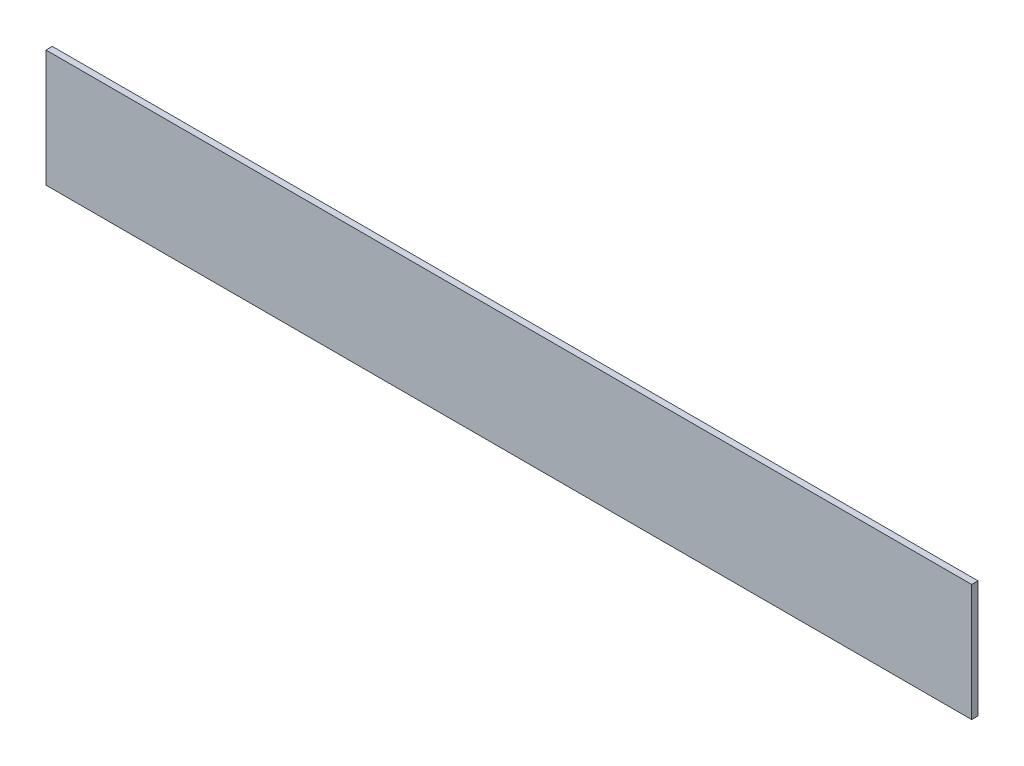
ISO-10303-21;
HEADER;
FILE_DESCRIPTION(('STEP AP214'),'2;1');
FILE_NAME('part.step','',(''),(''),'','','');
FILE_SCHEMA(('AUTOMOTIVE_DESIGN { 1 0 10303 214 1 1 1 1 }'));
ENDSEC;
DATA;
#1=APPLICATION_CONTEXT('core data for automotive mechanical design processes');
#2=APPLICATION_PROTOCOL_DEFINITION('international standard','automotive_design',2000,#1);
#3=PRODUCT_CONTEXT('',#1,'mechanical');
#4=PRODUCT('Part','Part','',(#3));
#5=PRODUCT_RELATED_PRODUCT_CATEGORY('part','',(#4));
#6=PRODUCT_DEFINITION_FORMATION('','',#4);
#7=PRODUCT_DEFINITION_CONTEXT('part definition',#1,'design');
#8=PRODUCT_DEFINITION('design','',#6,#7);
#9=PRODUCT_DEFINITION_SHAPE('','',#8);
#10=(LENGTH_UNIT() NAMED_UNIT(*) SI_UNIT(.MILLI.,.METRE.));
#11=(NAMED_UNIT(*) PLANE_ANGLE_UNIT() SI_UNIT($,.RADIAN.));
#12=(NAMED_UNIT(*) SI_UNIT($,.STERADIAN.) SOLID_ANGLE_UNIT());
#13=UNCERTAINTY_MEASURE_WITH_UNIT(LENGTH_MEASURE(1.E-05),#10,'distance_accuracy_value','');
#14=(GEOMETRIC_REPRESENTATION_CONTEXT(3) GLOBAL_UNCERTAINTY_ASSIGNED_CONTEXT((#13)) GLOBAL_UNIT_ASSIGNED_CONTEXT((#10,
#11,#12)) REPRESENTATION_CONTEXT('',''));
#15=CARTESIAN_POINT('',(0.,0.,0.));
#16=DIRECTION('',(0.,0.,1.));
#17=DIRECTION('',(1.,0.,0.));
#18=AXIS2_PLACEMENT_3D('',#15,#16,#17);
#19=CARTESIAN_POINT('',(-219.5,-27.75,-3.));
#20=DIRECTION('',(-1.,0.,0.));
#21=DIRECTION('',(0.,0.,1.));
#22=AXIS2_PLACEMENT_3D('',#19,#20,#21);
#23=PLANE('',#22);
#24=DIRECTION('',(0.,-1.,0.));
#25=VECTOR('',#24,1.);
#26=CARTESIAN_POINT('',(-219.5,-27.75,0.));
#27=LINE('',#26,#25);
#28=CARTESIAN_POINT('',(-219.5,27.75,0.));
#29=VERTEX_POINT('',#28);
#30=CARTESIAN_POINT('',(-219.5,-27.75,0.));
#31=VERTEX_POINT('',#30);
#32=EDGE_CURVE('E96',#29,#31,#27,.T.);
#33=ORIENTED_EDGE('',*,*,#32,.F.);
#34=DIRECTION('',(0.,0.,1.));
#35=VECTOR('',#34,1.);
#36=CARTESIAN_POINT('',(-219.5,27.75,-3.));
#37=LINE('',#36,#35);
#38=CARTESIAN_POINT('',(-219.5,27.75,-3.));
#39=VERTEX_POINT('',#38);
#40=EDGE_CURVE('E11',#39,#29,#37,.T.);
#41=ORIENTED_EDGE('',*,*,#40,.F.);
#42=DIRECTION('',(0.,-1.,0.));
#43=VECTOR('',#42,1.);
#44=CARTESIAN_POINT('',(-219.5,-27.75,-3.));
#45=LINE('',#44,#43);
#46=CARTESIAN_POINT('',(-219.5,-27.75,-3.));
#47=VERTEX_POINT('',#46);
#48=EDGE_CURVE('E90',#39,#47,#45,.T.);
#49=ORIENTED_EDGE('',*,*,#48,.T.);
#50=DIRECTION('',(0.,0.,1.));
#51=VECTOR('',#50,1.);
#52=CARTESIAN_POINT('',(-219.5,-27.75,-3.));
#53=LINE('',#52,#51);
#54=EDGE_CURVE('E35',#47,#31,#53,.T.);
#55=ORIENTED_EDGE('',*,*,#54,.T.);
#56=EDGE_LOOP('',(#33,#41,#49,#55));
#57=FACE_BOUND('',#56,.T.);
#58=ADVANCED_FACE('F32',(#57),#23,.T.);
#59=CARTESIAN_POINT('',(219.5,27.75,-3.));
#60=DIRECTION('',(0.,1.,0.));
#61=DIRECTION('',(-1.,0.,0.));
#62=AXIS2_PLACEMENT_3D('',#59,#60,#61);
#63=PLANE('',#62);
#64=DIRECTION('',(-1.,0.,0.));
#65=VECTOR('',#64,1.);
#66=CARTESIAN_POINT('',(219.5,27.75,0.));
#67=LINE('',#66,#65);
#68=CARTESIAN_POINT('',(219.5,27.75,0.));
#69=VERTEX_POINT('',#68);
#70=EDGE_CURVE('E92',#69,#29,#67,.T.);
#71=ORIENTED_EDGE('',*,*,#70,.F.);
#72=DIRECTION('',(0.,0.,1.));
#73=VECTOR('',#72,1.);
#74=CARTESIAN_POINT('',(219.5,27.75,-3.));
#75=LINE('',#74,#73);
#76=CARTESIAN_POINT('',(219.5,27.75,-3.));
#77=VERTEX_POINT('',#76);
#78=EDGE_CURVE('E41',#77,#69,#75,.T.);
#79=ORIENTED_EDGE('',*,*,#78,.F.);
#80=DIRECTION('',(-1.,0.,0.));
#81=VECTOR('',#80,1.);
#82=CARTESIAN_POINT('',(219.5,27.75,-3.));
#83=LINE('',#82,#81);
#84=EDGE_CURVE('E87',#77,#39,#83,.T.);
#85=ORIENTED_EDGE('',*,*,#84,.T.);
#86=ORIENTED_EDGE('',*,*,#40,.T.);
#87=EDGE_LOOP('',(#71,#79,#85,#86));
#88=FACE_BOUND('',#87,.T.);
#89=ADVANCED_FACE('F106',(#88),#63,.T.);
#90=CARTESIAN_POINT('',(219.5,-27.75,-3.));
#91=DIRECTION('',(1.,0.,0.));
#92=DIRECTION('',(0.,0.,-1.));
#93=AXIS2_PLACEMENT_3D('',#90,#91,#92);
#94=PLANE('',#93);
#95=DIRECTION('',(0.,1.,0.));
#96=VECTOR('',#95,1.);
#97=CARTESIAN_POINT('',(219.5,-27.75,0.));
#98=LINE('',#97,#96);
#99=CARTESIAN_POINT('',(219.5,-27.75,0.));
#100=VERTEX_POINT('',#99);
#101=EDGE_CURVE('E82',#100,#69,#98,.T.);
#102=ORIENTED_EDGE('',*,*,#101,.F.);
#103=DIRECTION('',(0.,0.,1.));
#104=VECTOR('',#103,1.);
#105=CARTESIAN_POINT('',(219.5,-27.75,-3.));
#106=LINE('',#105,#104);
#107=CARTESIAN_POINT('',(219.5,-27.75,-3.));
#108=VERTEX_POINT('',#107);
#109=EDGE_CURVE('E77',#108,#100,#106,.T.);
#110=ORIENTED_EDGE('',*,*,#109,.F.);
#111=DIRECTION('',(0.,1.,0.));
#112=VECTOR('',#111,1.);
#113=CARTESIAN_POINT('',(219.5,-27.75,-3.));
#114=LINE('',#113,#112);
#115=EDGE_CURVE('E80',#108,#77,#114,.T.);
#116=ORIENTED_EDGE('',*,*,#115,.T.);
#117=ORIENTED_EDGE('',*,*,#78,.T.);
#118=EDGE_LOOP('',(#102,#110,#116,#117));
#119=FACE_BOUND('',#118,.T.);
#120=ADVANCED_FACE('F79',(#119),#94,.T.);
#121=CARTESIAN_POINT('',(219.5,-27.75,-3.));
#122=DIRECTION('',(0.,-1.,0.));
#123=DIRECTION('',(1.,0.,0.));
#124=AXIS2_PLACEMENT_3D('',#121,#122,#123);
#125=PLANE('',#124);
#126=DIRECTION('',(1.,0.,0.));
#127=VECTOR('',#126,1.);
#128=CARTESIAN_POINT('',(219.5,-27.75,0.));
#129=LINE('',#128,#127);
#130=EDGE_CURVE('E99',#31,#100,#129,.T.);
#131=ORIENTED_EDGE('',*,*,#130,.F.);
#132=ORIENTED_EDGE('',*,*,#54,.F.);
#133=DIRECTION('',(1.,0.,0.));
#134=VECTOR('',#133,1.);
#135=CARTESIAN_POINT('',(219.5,-27.75,-3.));
#136=LINE('',#135,#134);
#137=EDGE_CURVE('E86',#47,#108,#136,.T.);
#138=ORIENTED_EDGE('',*,*,#137,.T.);
#139=ORIENTED_EDGE('',*,*,#109,.T.);
#140=EDGE_LOOP('',(#131,#132,#138,#139));
#141=FACE_BOUND('',#140,.T.);
#142=ADVANCED_FACE('F89',(#141),#125,.T.);
#143=CARTESIAN_POINT('',(0.,0.,-3.));
#144=DIRECTION('',(0.,0.,1.));
#145=DIRECTION('',(1.,0.,0.));
#146=AXIS2_PLACEMENT_3D('',#143,#144,#145);
#147=PLANE('',#146);
#148=ORIENTED_EDGE('',*,*,#48,.F.);
#149=ORIENTED_EDGE('',*,*,#84,.F.);
#150=ORIENTED_EDGE('',*,*,#115,.F.);
#151=ORIENTED_EDGE('',*,*,#137,.F.);
#152=EDGE_LOOP('',(#148,#149,#150,#151));
#153=FACE_BOUND('',#152,.T.);
#154=ADVANCED_FACE('F85',(#153),#147,.F.);
#155=CARTESIAN_POINT('',(0.,0.,0.));
#156=DIRECTION('',(0.,0.,1.));
#157=DIRECTION('',(1.,0.,0.));
#158=AXIS2_PLACEMENT_3D('',#155,#156,#157);
#159=PLANE('',#158);
#160=ORIENTED_EDGE('',*,*,#32,.T.);
#161=ORIENTED_EDGE('',*,*,#130,.T.);
#162=ORIENTED_EDGE('',*,*,#101,.T.);
#163=ORIENTED_EDGE('',*,*,#70,.T.);
#164=EDGE_LOOP('',(#160,#161,#162,#163));
#165=FACE_BOUND('',#164,.T.);
#166=ADVANCED_FACE('F105',(#165),#159,.T.);
#167=CLOSED_SHELL('',(#58,#89,#120,#142,#154,#166));
#168=MANIFOLD_SOLID_BREP('B2',#167);
#169=ADVANCED_BREP_SHAPE_REPRESENTATION('',(#18,#168),#14);
#170=SHAPE_DEFINITION_REPRESENTATION(#9,#169);
ENDSEC;
END-ISO-10303-21;
